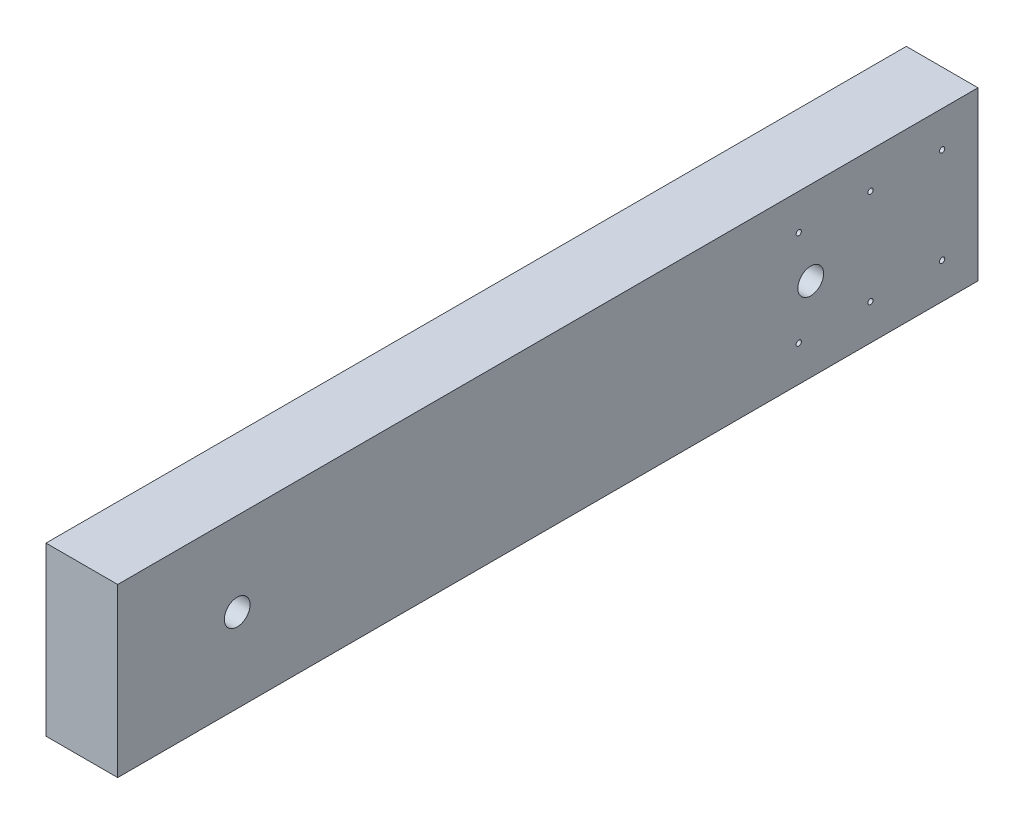
ISO-10303-21;
HEADER;
FILE_DESCRIPTION(('STEP AP214'),'2;1');
FILE_NAME('part.step','',(''),(''),'','','');
FILE_SCHEMA(('AUTOMOTIVE_DESIGN { 1 0 10303 214 1 1 1 1 }'));
ENDSEC;
DATA;
#1=APPLICATION_CONTEXT('core data for automotive mechanical design processes');
#2=APPLICATION_PROTOCOL_DEFINITION('international standard','automotive_design',2000,#1);
#3=PRODUCT_CONTEXT('',#1,'mechanical');
#4=PRODUCT('Part','Part','',(#3));
#5=PRODUCT_RELATED_PRODUCT_CATEGORY('part','',(#4));
#6=PRODUCT_DEFINITION_FORMATION('','',#4);
#7=PRODUCT_DEFINITION_CONTEXT('part definition',#1,'design');
#8=PRODUCT_DEFINITION('design','',#6,#7);
#9=PRODUCT_DEFINITION_SHAPE('','',#8);
#10=(LENGTH_UNIT() NAMED_UNIT(*) SI_UNIT(.MILLI.,.METRE.));
#11=(NAMED_UNIT(*) PLANE_ANGLE_UNIT() SI_UNIT($,.RADIAN.));
#12=(NAMED_UNIT(*) SI_UNIT($,.STERADIAN.) SOLID_ANGLE_UNIT());
#13=UNCERTAINTY_MEASURE_WITH_UNIT(LENGTH_MEASURE(1.E-05),#10,'distance_accuracy_value','');
#14=(GEOMETRIC_REPRESENTATION_CONTEXT(3) GLOBAL_UNCERTAINTY_ASSIGNED_CONTEXT((#13)) GLOBAL_UNIT_ASSIGNED_CONTEXT((#10,
#11,#12)) REPRESENTATION_CONTEXT('',''));
#15=CARTESIAN_POINT('',(0.,0.,0.));
#16=DIRECTION('',(0.,0.,1.));
#17=DIRECTION('',(1.,0.,0.));
#18=AXIS2_PLACEMENT_3D('',#15,#16,#17);
#19=CARTESIAN_POINT('',(57.277,-38.1,876.3));
#20=DIRECTION('',(1.,0.,0.));
#21=DIRECTION('',(0.,1.,0.));
#22=AXIS2_PLACEMENT_3D('',#19,#20,#21);
#23=PLANE('',#22);
#24=CARTESIAN_POINT('',(57.277,-82.55,812.8));
#25=DIRECTION('',(-1.,0.,0.));
#26=DIRECTION('',(0.,-1.,0.));
#27=AXIS2_PLACEMENT_3D('',#24,#25,#26);
#28=CIRCLE('',#27,6.84999999999997);
#29=CARTESIAN_POINT('',(57.277,-89.3999999999999,812.8));
#30=VERTEX_POINT('',#29);
#31=EDGE_CURVE('E119',#30,#30,#28,.T.);
#32=ORIENTED_EDGE('',*,*,#31,.F.);
#33=EDGE_LOOP('',(#32));
#34=FACE_BOUND('',#33,.T.);
#35=CARTESIAN_POINT('',(57.277,-82.55,508.));
#36=DIRECTION('',(1.,0.,0.));
#37=DIRECTION('',(0.,1.,0.));
#38=AXIS2_PLACEMENT_3D('',#35,#36,#37);
#39=CIRCLE('',#38,6.84999999999997);
#40=CARTESIAN_POINT('',(57.277,-75.7,508.));
#41=VERTEX_POINT('',#40);
#42=EDGE_CURVE('E112',#41,#41,#39,.F.);
#43=ORIENTED_EDGE('',*,*,#42,.F.);
#44=EDGE_LOOP('',(#43));
#45=FACE_BOUND('',#44,.T.);
#46=CARTESIAN_POINT('',(57.2770000000001,-107.95,438.15));
#47=DIRECTION('',(1.,0.,0.));
#48=DIRECTION('',(0.,1.,0.));
#49=AXIS2_PLACEMENT_3D('',#46,#47,#48);
#50=CIRCLE('',#49,1.3890625000001);
#51=CARTESIAN_POINT('',(57.2770000000001,-106.5609375,438.15));
#52=VERTEX_POINT('',#51);
#53=EDGE_CURVE('E116',#52,#52,#50,.T.);
#54=ORIENTED_EDGE('',*,*,#53,.T.);
#55=EDGE_LOOP('',(#54));
#56=FACE_BOUND('',#55,.T.);
#57=CARTESIAN_POINT('',(57.2770000000001,-107.95,476.25));
#58=DIRECTION('',(1.,0.,0.));
#59=DIRECTION('',(0.,1.,0.));
#60=AXIS2_PLACEMENT_3D('',#57,#58,#59);
#61=CIRCLE('',#60,1.3890625000001);
#62=CARTESIAN_POINT('',(57.2770000000001,-106.5609375,476.25));
#63=VERTEX_POINT('',#62);
#64=EDGE_CURVE('E132',#63,#63,#61,.T.);
#65=ORIENTED_EDGE('',*,*,#64,.T.);
#66=EDGE_LOOP('',(#65));
#67=FACE_BOUND('',#66,.T.);
#68=CARTESIAN_POINT('',(57.277,-57.15,476.25));
#69=DIRECTION('',(1.,0.,0.));
#70=DIRECTION('',(0.,1.,0.));
#71=AXIS2_PLACEMENT_3D('',#68,#69,#70);
#72=CIRCLE('',#71,1.38906250000009);
#73=CARTESIAN_POINT('',(57.277,-55.7609374999999,476.25));
#74=VERTEX_POINT('',#73);
#75=EDGE_CURVE('E138',#74,#74,#72,.T.);
#76=ORIENTED_EDGE('',*,*,#75,.T.);
#77=EDGE_LOOP('',(#76));
#78=FACE_BOUND('',#77,.T.);
#79=CARTESIAN_POINT('',(57.277,-57.15,514.35));
#80=DIRECTION('',(1.,0.,0.));
#81=DIRECTION('',(0.,1.,0.));
#82=AXIS2_PLACEMENT_3D('',#79,#80,#81);
#83=CIRCLE('',#82,1.3890625000001);
#84=CARTESIAN_POINT('',(57.277,-55.7609374999999,514.35));
#85=VERTEX_POINT('',#84);
#86=EDGE_CURVE('E144',#85,#85,#83,.T.);
#87=ORIENTED_EDGE('',*,*,#86,.T.);
#88=EDGE_LOOP('',(#87));
#89=FACE_BOUND('',#88,.T.);
#90=CARTESIAN_POINT('',(57.2770000000001,-107.95,514.35));
#91=DIRECTION('',(1.,0.,0.));
#92=DIRECTION('',(0.,1.,0.));
#93=AXIS2_PLACEMENT_3D('',#90,#91,#92);
#94=CIRCLE('',#93,1.3890625000001);
#95=CARTESIAN_POINT('',(57.2770000000001,-106.5609375,514.35));
#96=VERTEX_POINT('',#95);
#97=EDGE_CURVE('E150',#96,#96,#94,.T.);
#98=ORIENTED_EDGE('',*,*,#97,.T.);
#99=EDGE_LOOP('',(#98));
#100=FACE_BOUND('',#99,.T.);
#101=CARTESIAN_POINT('',(57.277,-57.15,438.15));
#102=DIRECTION('',(1.,0.,0.));
#103=DIRECTION('',(0.,1.,0.));
#104=AXIS2_PLACEMENT_3D('',#101,#102,#103);
#105=CIRCLE('',#104,1.38906250000009);
#106=CARTESIAN_POINT('',(57.277,-55.7609374999999,438.15));
#107=VERTEX_POINT('',#106);
#108=EDGE_CURVE('E156',#107,#107,#105,.T.);
#109=ORIENTED_EDGE('',*,*,#108,.T.);
#110=EDGE_LOOP('',(#109));
#111=FACE_BOUND('',#110,.T.);
#112=DIRECTION('',(0.,-1.,0.));
#113=VECTOR('',#112,1.);
#114=CARTESIAN_POINT('',(57.277,-38.1,419.1));
#115=LINE('',#114,#113);
#116=CARTESIAN_POINT('',(57.277,-38.1,419.1));
#117=VERTEX_POINT('',#116);
#118=CARTESIAN_POINT('',(57.277,-127.,419.1));
#119=VERTEX_POINT('',#118);
#120=EDGE_CURVE('E102',#117,#119,#115,.T.);
#121=ORIENTED_EDGE('',*,*,#120,.T.);
#122=DIRECTION('',(0.,0.,-1.));
#123=VECTOR('',#122,1.);
#124=CARTESIAN_POINT('',(57.277,-127.,876.3));
#125=LINE('',#124,#123);
#126=CARTESIAN_POINT('',(57.277,-127.,876.3));
#127=VERTEX_POINT('',#126);
#128=EDGE_CURVE('E11',#127,#119,#125,.T.);
#129=ORIENTED_EDGE('',*,*,#128,.F.);
#130=DIRECTION('',(0.,-1.,0.));
#131=VECTOR('',#130,1.);
#132=CARTESIAN_POINT('',(57.277,-38.1,876.3));
#133=LINE('',#132,#131);
#134=CARTESIAN_POINT('',(57.277,-38.1,876.3));
#135=VERTEX_POINT('',#134);
#136=EDGE_CURVE('E89',#135,#127,#133,.T.);
#137=ORIENTED_EDGE('',*,*,#136,.F.);
#138=DIRECTION('',(0.,0.,-1.));
#139=VECTOR('',#138,1.);
#140=CARTESIAN_POINT('',(57.277,-38.1,876.3));
#141=LINE('',#140,#139);
#142=EDGE_CURVE('E98',#135,#117,#141,.T.);
#143=ORIENTED_EDGE('',*,*,#142,.T.);
#144=EDGE_LOOP('',(#121,#129,#137,#143));
#145=FACE_BOUND('',#144,.T.);
#146=ADVANCED_FACE('F36',(#34,#45,#56,#67,#78,#89,#100,#111,#145),#23,.F.);
#147=CARTESIAN_POINT('',(57.277,-127.,876.3));
#148=DIRECTION('',(0.,1.,0.));
#149=DIRECTION('',(0.,0.,1.));
#150=AXIS2_PLACEMENT_3D('',#147,#148,#149);
#151=PLANE('',#150);
#152=DIRECTION('',(1.,0.,0.));
#153=VECTOR('',#152,1.);
#154=CARTESIAN_POINT('',(57.277,-127.,419.1));
#155=LINE('',#154,#153);
#156=CARTESIAN_POINT('',(95.377,-127.,419.1));
#157=VERTEX_POINT('',#156);
#158=EDGE_CURVE('E93',#119,#157,#155,.T.);
#159=ORIENTED_EDGE('',*,*,#158,.T.);
#160=DIRECTION('',(0.,0.,-1.));
#161=VECTOR('',#160,1.);
#162=CARTESIAN_POINT('',(95.377,-127.,876.3));
#163=LINE('',#162,#161);
#164=CARTESIAN_POINT('',(95.377,-127.,876.3));
#165=VERTEX_POINT('',#164);
#166=EDGE_CURVE('E45',#165,#157,#163,.T.);
#167=ORIENTED_EDGE('',*,*,#166,.F.);
#168=DIRECTION('',(1.,0.,0.));
#169=VECTOR('',#168,1.);
#170=CARTESIAN_POINT('',(57.277,-127.,876.3));
#171=LINE('',#170,#169);
#172=EDGE_CURVE('E84',#127,#165,#171,.T.);
#173=ORIENTED_EDGE('',*,*,#172,.F.);
#174=ORIENTED_EDGE('',*,*,#128,.T.);
#175=EDGE_LOOP('',(#159,#167,#173,#174));
#176=FACE_BOUND('',#175,.T.);
#177=ADVANCED_FACE('F92',(#176),#151,.F.);
#178=CARTESIAN_POINT('',(95.377,-38.1,876.3));
#179=DIRECTION('',(-1.,0.,0.));
#180=DIRECTION('',(0.,-1.,0.));
#181=AXIS2_PLACEMENT_3D('',#178,#179,#180);
#182=PLANE('',#181);
#183=CARTESIAN_POINT('',(95.377,-82.55,812.8));
#184=DIRECTION('',(-1.,0.,0.));
#185=DIRECTION('',(0.,-1.,0.));
#186=AXIS2_PLACEMENT_3D('',#183,#184,#185);
#187=CIRCLE('',#186,6.84999999999997);
#188=CARTESIAN_POINT('',(95.3770000000001,-89.3999999999999,812.8));
#189=VERTEX_POINT('',#188);
#190=EDGE_CURVE('E39',#189,#189,#187,.T.);
#191=ORIENTED_EDGE('',*,*,#190,.T.);
#192=EDGE_LOOP('',(#191));
#193=FACE_BOUND('',#192,.T.);
#194=CARTESIAN_POINT('',(95.377,-82.55,508.));
#195=DIRECTION('',(-1.,0.,0.));
#196=DIRECTION('',(0.,-1.,0.));
#197=AXIS2_PLACEMENT_3D('',#194,#195,#196);
#198=CIRCLE('',#197,6.84999999999997);
#199=CARTESIAN_POINT('',(95.377,-89.3999999999999,508.));
#200=VERTEX_POINT('',#199);
#201=EDGE_CURVE('E110',#200,#200,#198,.F.);
#202=ORIENTED_EDGE('',*,*,#201,.F.);
#203=EDGE_LOOP('',(#202));
#204=FACE_BOUND('',#203,.T.);
#205=CARTESIAN_POINT('',(95.377,-57.1499999999999,438.15));
#206=DIRECTION('',(1.,0.,0.));
#207=DIRECTION('',(0.,1.,0.));
#208=AXIS2_PLACEMENT_3D('',#205,#206,#207);
#209=CIRCLE('',#208,1.38906250000009);
#210=CARTESIAN_POINT('',(95.377,-55.7609374999999,438.15));
#211=VERTEX_POINT('',#210);
#212=EDGE_CURVE('E165',#211,#211,#209,.T.);
#213=ORIENTED_EDGE('',*,*,#212,.F.);
#214=EDGE_LOOP('',(#213));
#215=FACE_BOUND('',#214,.T.);
#216=CARTESIAN_POINT('',(95.377,-107.95,438.15));
#217=DIRECTION('',(1.,0.,0.));
#218=DIRECTION('',(0.,1.,0.));
#219=AXIS2_PLACEMENT_3D('',#216,#217,#218);
#220=CIRCLE('',#219,1.3890625000001);
#221=CARTESIAN_POINT('',(95.377,-106.5609375,438.15));
#222=VERTEX_POINT('',#221);
#223=EDGE_CURVE('E171',#222,#222,#220,.T.);
#224=ORIENTED_EDGE('',*,*,#223,.F.);
#225=EDGE_LOOP('',(#224));
#226=FACE_BOUND('',#225,.T.);
#227=CARTESIAN_POINT('',(95.377,-107.95,476.25));
#228=DIRECTION('',(1.,0.,0.));
#229=DIRECTION('',(0.,1.,0.));
#230=AXIS2_PLACEMENT_3D('',#227,#228,#229);
#231=CIRCLE('',#230,1.3890625000001);
#232=CARTESIAN_POINT('',(95.377,-106.5609375,476.25));
#233=VERTEX_POINT('',#232);
#234=EDGE_CURVE('E177',#233,#233,#231,.T.);
#235=ORIENTED_EDGE('',*,*,#234,.F.);
#236=EDGE_LOOP('',(#235));
#237=FACE_BOUND('',#236,.T.);
#238=CARTESIAN_POINT('',(95.377,-57.1499999999999,476.25));
#239=DIRECTION('',(1.,0.,0.));
#240=DIRECTION('',(0.,1.,0.));
#241=AXIS2_PLACEMENT_3D('',#238,#239,#240);
#242=CIRCLE('',#241,1.38906250000009);
#243=CARTESIAN_POINT('',(95.377,-55.7609374999999,476.25));
#244=VERTEX_POINT('',#243);
#245=EDGE_CURVE('E183',#244,#244,#242,.T.);
#246=ORIENTED_EDGE('',*,*,#245,.F.);
#247=EDGE_LOOP('',(#246));
#248=FACE_BOUND('',#247,.T.);
#249=CARTESIAN_POINT('',(95.377,-57.1499999999999,514.35));
#250=DIRECTION('',(1.,0.,0.));
#251=DIRECTION('',(0.,1.,0.));
#252=AXIS2_PLACEMENT_3D('',#249,#250,#251);
#253=CIRCLE('',#252,1.3890625000001);
#254=CARTESIAN_POINT('',(95.377,-55.7609374999998,514.35));
#255=VERTEX_POINT('',#254);
#256=EDGE_CURVE('E189',#255,#255,#253,.T.);
#257=ORIENTED_EDGE('',*,*,#256,.F.);
#258=EDGE_LOOP('',(#257));
#259=FACE_BOUND('',#258,.T.);
#260=CARTESIAN_POINT('',(95.377,-107.95,514.35));
#261=DIRECTION('',(1.,0.,0.));
#262=DIRECTION('',(0.,1.,0.));
#263=AXIS2_PLACEMENT_3D('',#260,#261,#262);
#264=CIRCLE('',#263,1.3890625000001);
#265=CARTESIAN_POINT('',(95.377,-106.5609375,514.35));
#266=VERTEX_POINT('',#265);
#267=EDGE_CURVE('E162',#266,#266,#264,.T.);
#268=ORIENTED_EDGE('',*,*,#267,.F.);
#269=EDGE_LOOP('',(#268));
#270=FACE_BOUND('',#269,.T.);
#271=DIRECTION('',(0.,1.,0.));
#272=VECTOR('',#271,1.);
#273=CARTESIAN_POINT('',(95.377,-38.1,419.1));
#274=LINE('',#273,#272);
#275=CARTESIAN_POINT('',(95.377,-38.1,419.1));
#276=VERTEX_POINT('',#275);
#277=EDGE_CURVE('E71',#157,#276,#274,.T.);
#278=ORIENTED_EDGE('',*,*,#277,.T.);
#279=DIRECTION('',(0.,0.,-1.));
#280=VECTOR('',#279,1.);
#281=CARTESIAN_POINT('',(95.377,-38.1,876.3));
#282=LINE('',#281,#280);
#283=CARTESIAN_POINT('',(95.377,-38.1,876.3));
#284=VERTEX_POINT('',#283);
#285=EDGE_CURVE('E94',#284,#276,#282,.T.);
#286=ORIENTED_EDGE('',*,*,#285,.F.);
#287=DIRECTION('',(0.,1.,0.));
#288=VECTOR('',#287,1.);
#289=CARTESIAN_POINT('',(95.377,-38.1,876.3));
#290=LINE('',#289,#288);
#291=EDGE_CURVE('E87',#165,#284,#290,.T.);
#292=ORIENTED_EDGE('',*,*,#291,.F.);
#293=ORIENTED_EDGE('',*,*,#166,.T.);
#294=EDGE_LOOP('',(#278,#286,#292,#293));
#295=FACE_BOUND('',#294,.T.);
#296=ADVANCED_FACE('F96',(#193,#204,#215,#226,#237,#248,#259,#270,#295),#182,.F.);
#297=CARTESIAN_POINT('',(57.277,-38.1,876.3));
#298=DIRECTION('',(0.,-1.,0.));
#299=DIRECTION('',(0.,0.,-1.));
#300=AXIS2_PLACEMENT_3D('',#297,#298,#299);
#301=PLANE('',#300);
#302=DIRECTION('',(-1.,0.,0.));
#303=VECTOR('',#302,1.);
#304=CARTESIAN_POINT('',(57.277,-38.1,419.1));
#305=LINE('',#304,#303);
#306=EDGE_CURVE('E77',#276,#117,#305,.T.);
#307=ORIENTED_EDGE('',*,*,#306,.T.);
#308=ORIENTED_EDGE('',*,*,#142,.F.);
#309=DIRECTION('',(-1.,0.,0.));
#310=VECTOR('',#309,1.);
#311=CARTESIAN_POINT('',(57.277,-38.1,876.3));
#312=LINE('',#311,#310);
#313=EDGE_CURVE('E54',#284,#135,#312,.T.);
#314=ORIENTED_EDGE('',*,*,#313,.F.);
#315=ORIENTED_EDGE('',*,*,#285,.T.);
#316=EDGE_LOOP('',(#307,#308,#314,#315));
#317=FACE_BOUND('',#316,.T.);
#318=ADVANCED_FACE('F201',(#317),#301,.F.);
#319=CARTESIAN_POINT('',(0.,0.,876.3));
#320=DIRECTION('',(0.,0.,1.));
#321=DIRECTION('',(1.,0.,0.));
#322=AXIS2_PLACEMENT_3D('',#319,#320,#321);
#323=PLANE('',#322);
#324=ORIENTED_EDGE('',*,*,#136,.T.);
#325=ORIENTED_EDGE('',*,*,#172,.T.);
#326=ORIENTED_EDGE('',*,*,#291,.T.);
#327=ORIENTED_EDGE('',*,*,#313,.T.);
#328=EDGE_LOOP('',(#324,#325,#326,#327));
#329=FACE_BOUND('',#328,.T.);
#330=ADVANCED_FACE('F85',(#329),#323,.T.);
#331=CARTESIAN_POINT('',(0.,0.,419.1));
#332=DIRECTION('',(0.,0.,1.));
#333=DIRECTION('',(1.,0.,0.));
#334=AXIS2_PLACEMENT_3D('',#331,#332,#333);
#335=PLANE('',#334);
#336=ORIENTED_EDGE('',*,*,#120,.F.);
#337=ORIENTED_EDGE('',*,*,#306,.F.);
#338=ORIENTED_EDGE('',*,*,#277,.F.);
#339=ORIENTED_EDGE('',*,*,#158,.F.);
#340=EDGE_LOOP('',(#336,#337,#338,#339));
#341=FACE_BOUND('',#340,.T.);
#342=ADVANCED_FACE('F230',(#341),#335,.F.);
#343=CARTESIAN_POINT('',(82.677,-107.95,514.35));
#344=DIRECTION('',(1.,0.,0.));
#345=DIRECTION('',(0.,1.,0.));
#346=AXIS2_PLACEMENT_3D('',#343,#344,#345);
#347=CYLINDRICAL_SURFACE('',#346,1.3890625000001);
#348=CARTESIAN_POINT('',(82.677,-107.95,514.35));
#349=DIRECTION('',(1.,0.,0.));
#350=DIRECTION('',(0.,1.,0.));
#351=AXIS2_PLACEMENT_3D('',#348,#349,#350);
#352=CIRCLE('',#351,1.3890625000001);
#353=CARTESIAN_POINT('',(82.677,-106.5609375,514.35));
#354=VERTEX_POINT('',#353);
#355=EDGE_CURVE('E192',#354,#354,#352,.T.);
#356=ORIENTED_EDGE('',*,*,#355,.F.);
#357=EDGE_LOOP('',(#356));
#358=FACE_BOUND('',#357,.T.);
#359=ORIENTED_EDGE('',*,*,#267,.T.);
#360=EDGE_LOOP('',(#359));
#361=FACE_BOUND('',#360,.T.);
#362=ADVANCED_FACE('F198',(#358,#361),#347,.F.);
#363=CARTESIAN_POINT('',(82.677,-107.95,514.35));
#364=DIRECTION('',(1.,0.,0.));
#365=DIRECTION('',(0.,1.,0.));
#366=AXIS2_PLACEMENT_3D('',#363,#364,#365);
#367=PLANE('',#366);
#368=ORIENTED_EDGE('',*,*,#355,.T.);
#369=EDGE_LOOP('',(#368));
#370=FACE_BOUND('',#369,.T.);
#371=ADVANCED_FACE('F237',(#370),#367,.T.);
#372=CARTESIAN_POINT('',(82.677,-57.1499999999999,514.35));
#373=DIRECTION('',(1.,0.,0.));
#374=DIRECTION('',(0.,1.,0.));
#375=AXIS2_PLACEMENT_3D('',#372,#373,#374);
#376=CYLINDRICAL_SURFACE('',#375,1.3890625000001);
#377=CARTESIAN_POINT('',(82.677,-57.1499999999999,514.35));
#378=DIRECTION('',(1.,0.,0.));
#379=DIRECTION('',(0.,1.,0.));
#380=AXIS2_PLACEMENT_3D('',#377,#378,#379);
#381=CIRCLE('',#380,1.3890625000001);
#382=CARTESIAN_POINT('',(82.677,-55.7609374999998,514.35));
#383=VERTEX_POINT('',#382);
#384=EDGE_CURVE('E186',#383,#383,#381,.T.);
#385=ORIENTED_EDGE('',*,*,#384,.F.);
#386=EDGE_LOOP('',(#385));
#387=FACE_BOUND('',#386,.T.);
#388=ORIENTED_EDGE('',*,*,#256,.T.);
#389=EDGE_LOOP('',(#388));
#390=FACE_BOUND('',#389,.T.);
#391=ADVANCED_FACE('F244',(#387,#390),#376,.F.);
#392=CARTESIAN_POINT('',(82.677,-57.1499999999999,514.35));
#393=DIRECTION('',(1.,0.,0.));
#394=DIRECTION('',(0.,1.,0.));
#395=AXIS2_PLACEMENT_3D('',#392,#393,#394);
#396=PLANE('',#395);
#397=ORIENTED_EDGE('',*,*,#384,.T.);
#398=EDGE_LOOP('',(#397));
#399=FACE_BOUND('',#398,.T.);
#400=ADVANCED_FACE('F248',(#399),#396,.T.);
#401=CARTESIAN_POINT('',(82.677,-57.1499999999999,476.25));
#402=DIRECTION('',(1.,0.,0.));
#403=DIRECTION('',(0.,1.,0.));
#404=AXIS2_PLACEMENT_3D('',#401,#402,#403);
#405=CYLINDRICAL_SURFACE('',#404,1.38906250000009);
#406=CARTESIAN_POINT('',(82.677,-57.1499999999999,476.25));
#407=DIRECTION('',(1.,0.,0.));
#408=DIRECTION('',(0.,1.,0.));
#409=AXIS2_PLACEMENT_3D('',#406,#407,#408);
#410=CIRCLE('',#409,1.38906250000009);
#411=CARTESIAN_POINT('',(82.677,-55.7609374999999,476.25));
#412=VERTEX_POINT('',#411);
#413=EDGE_CURVE('E180',#412,#412,#410,.T.);
#414=ORIENTED_EDGE('',*,*,#413,.F.);
#415=EDGE_LOOP('',(#414));
#416=FACE_BOUND('',#415,.T.);
#417=ORIENTED_EDGE('',*,*,#245,.T.);
#418=EDGE_LOOP('',(#417));
#419=FACE_BOUND('',#418,.T.);
#420=ADVANCED_FACE('F252',(#416,#419),#405,.F.);
#421=CARTESIAN_POINT('',(82.677,-57.1499999999999,476.25));
#422=DIRECTION('',(1.,0.,0.));
#423=DIRECTION('',(0.,1.,0.));
#424=AXIS2_PLACEMENT_3D('',#421,#422,#423);
#425=PLANE('',#424);
#426=ORIENTED_EDGE('',*,*,#413,.T.);
#427=EDGE_LOOP('',(#426));
#428=FACE_BOUND('',#427,.T.);
#429=ADVANCED_FACE('F256',(#428),#425,.T.);
#430=CARTESIAN_POINT('',(82.677,-107.95,476.25));
#431=DIRECTION('',(1.,0.,0.));
#432=DIRECTION('',(0.,1.,0.));
#433=AXIS2_PLACEMENT_3D('',#430,#431,#432);
#434=CYLINDRICAL_SURFACE('',#433,1.3890625000001);
#435=CARTESIAN_POINT('',(82.677,-107.95,476.25));
#436=DIRECTION('',(1.,0.,0.));
#437=DIRECTION('',(0.,1.,0.));
#438=AXIS2_PLACEMENT_3D('',#435,#436,#437);
#439=CIRCLE('',#438,1.3890625000001);
#440=CARTESIAN_POINT('',(82.677,-106.5609375,476.25));
#441=VERTEX_POINT('',#440);
#442=EDGE_CURVE('E174',#441,#441,#439,.T.);
#443=ORIENTED_EDGE('',*,*,#442,.F.);
#444=EDGE_LOOP('',(#443));
#445=FACE_BOUND('',#444,.T.);
#446=ORIENTED_EDGE('',*,*,#234,.T.);
#447=EDGE_LOOP('',(#446));
#448=FACE_BOUND('',#447,.T.);
#449=ADVANCED_FACE('F260',(#445,#448),#434,.F.);
#450=CARTESIAN_POINT('',(82.677,-107.95,476.25));
#451=DIRECTION('',(1.,0.,0.));
#452=DIRECTION('',(0.,1.,0.));
#453=AXIS2_PLACEMENT_3D('',#450,#451,#452);
#454=PLANE('',#453);
#455=ORIENTED_EDGE('',*,*,#442,.T.);
#456=EDGE_LOOP('',(#455));
#457=FACE_BOUND('',#456,.T.);
#458=ADVANCED_FACE('F264',(#457),#454,.T.);
#459=CARTESIAN_POINT('',(82.677,-107.95,438.15));
#460=DIRECTION('',(1.,0.,0.));
#461=DIRECTION('',(0.,1.,0.));
#462=AXIS2_PLACEMENT_3D('',#459,#460,#461);
#463=CYLINDRICAL_SURFACE('',#462,1.3890625000001);
#464=CARTESIAN_POINT('',(82.677,-107.95,438.15));
#465=DIRECTION('',(1.,0.,0.));
#466=DIRECTION('',(0.,1.,0.));
#467=AXIS2_PLACEMENT_3D('',#464,#465,#466);
#468=CIRCLE('',#467,1.3890625000001);
#469=CARTESIAN_POINT('',(82.677,-106.5609375,438.15));
#470=VERTEX_POINT('',#469);
#471=EDGE_CURVE('E168',#470,#470,#468,.T.);
#472=ORIENTED_EDGE('',*,*,#471,.F.);
#473=EDGE_LOOP('',(#472));
#474=FACE_BOUND('',#473,.T.);
#475=ORIENTED_EDGE('',*,*,#223,.T.);
#476=EDGE_LOOP('',(#475));
#477=FACE_BOUND('',#476,.T.);
#478=ADVANCED_FACE('F268',(#474,#477),#463,.F.);
#479=CARTESIAN_POINT('',(82.677,-107.95,438.15));
#480=DIRECTION('',(1.,0.,0.));
#481=DIRECTION('',(0.,1.,0.));
#482=AXIS2_PLACEMENT_3D('',#479,#480,#481);
#483=PLANE('',#482);
#484=ORIENTED_EDGE('',*,*,#471,.T.);
#485=EDGE_LOOP('',(#484));
#486=FACE_BOUND('',#485,.T.);
#487=ADVANCED_FACE('F272',(#486),#483,.T.);
#488=CARTESIAN_POINT('',(82.677,-57.1499999999999,438.15));
#489=DIRECTION('',(1.,0.,0.));
#490=DIRECTION('',(0.,1.,0.));
#491=AXIS2_PLACEMENT_3D('',#488,#489,#490);
#492=CYLINDRICAL_SURFACE('',#491,1.38906250000009);
#493=CARTESIAN_POINT('',(82.677,-57.1499999999999,438.15));
#494=DIRECTION('',(1.,0.,0.));
#495=DIRECTION('',(0.,1.,0.));
#496=AXIS2_PLACEMENT_3D('',#493,#494,#495);
#497=CIRCLE('',#496,1.38906250000009);
#498=CARTESIAN_POINT('',(82.677,-55.7609374999999,438.15));
#499=VERTEX_POINT('',#498);
#500=EDGE_CURVE('E105',#499,#499,#497,.T.);
#501=ORIENTED_EDGE('',*,*,#500,.F.);
#502=EDGE_LOOP('',(#501));
#503=FACE_BOUND('',#502,.T.);
#504=ORIENTED_EDGE('',*,*,#212,.T.);
#505=EDGE_LOOP('',(#504));
#506=FACE_BOUND('',#505,.T.);
#507=ADVANCED_FACE('F276',(#503,#506),#492,.F.);
#508=CARTESIAN_POINT('',(82.677,-57.1499999999999,438.15));
#509=DIRECTION('',(1.,0.,0.));
#510=DIRECTION('',(0.,1.,0.));
#511=AXIS2_PLACEMENT_3D('',#508,#509,#510);
#512=PLANE('',#511);
#513=ORIENTED_EDGE('',*,*,#500,.T.);
#514=EDGE_LOOP('',(#513));
#515=FACE_BOUND('',#514,.T.);
#516=ADVANCED_FACE('F280',(#515),#512,.T.);
#517=CARTESIAN_POINT('',(69.977,-57.15,438.15));
#518=DIRECTION('',(-1.,0.,0.));
#519=DIRECTION('',(0.,1.,0.));
#520=AXIS2_PLACEMENT_3D('',#517,#518,#519);
#521=CYLINDRICAL_SURFACE('',#520,1.38906250000009);
#522=CARTESIAN_POINT('',(69.977,-57.15,438.15));
#523=DIRECTION('',(1.,0.,0.));
#524=DIRECTION('',(0.,1.,0.));
#525=AXIS2_PLACEMENT_3D('',#522,#523,#524);
#526=CIRCLE('',#525,1.38906250000009);
#527=CARTESIAN_POINT('',(69.977,-55.7609374999999,438.15));
#528=VERTEX_POINT('',#527);
#529=EDGE_CURVE('E159',#528,#528,#526,.T.);
#530=ORIENTED_EDGE('',*,*,#529,.T.);
#531=EDGE_LOOP('',(#530));
#532=FACE_BOUND('',#531,.T.);
#533=ORIENTED_EDGE('',*,*,#108,.F.);
#534=EDGE_LOOP('',(#533));
#535=FACE_BOUND('',#534,.T.);
#536=ADVANCED_FACE('F284',(#532,#535),#521,.F.);
#537=CARTESIAN_POINT('',(69.977,-57.15,438.15));
#538=DIRECTION('',(-1.,0.,0.));
#539=DIRECTION('',(0.,1.,0.));
#540=AXIS2_PLACEMENT_3D('',#537,#538,#539);
#541=PLANE('',#540);
#542=ORIENTED_EDGE('',*,*,#529,.F.);
#543=EDGE_LOOP('',(#542));
#544=FACE_BOUND('',#543,.T.);
#545=ADVANCED_FACE('F288',(#544),#541,.T.);
#546=CARTESIAN_POINT('',(69.977,-107.95,514.35));
#547=DIRECTION('',(-1.,0.,0.));
#548=DIRECTION('',(0.,1.,0.));
#549=AXIS2_PLACEMENT_3D('',#546,#547,#548);
#550=CYLINDRICAL_SURFACE('',#549,1.3890625000001);
#551=CARTESIAN_POINT('',(69.977,-107.95,514.35));
#552=DIRECTION('',(1.,0.,0.));
#553=DIRECTION('',(0.,1.,0.));
#554=AXIS2_PLACEMENT_3D('',#551,#552,#553);
#555=CIRCLE('',#554,1.3890625000001);
#556=CARTESIAN_POINT('',(69.977,-106.5609375,514.35));
#557=VERTEX_POINT('',#556);
#558=EDGE_CURVE('E153',#557,#557,#555,.T.);
#559=ORIENTED_EDGE('',*,*,#558,.T.);
#560=EDGE_LOOP('',(#559));
#561=FACE_BOUND('',#560,.T.);
#562=ORIENTED_EDGE('',*,*,#97,.F.);
#563=EDGE_LOOP('',(#562));
#564=FACE_BOUND('',#563,.T.);
#565=ADVANCED_FACE('F292',(#561,#564),#550,.F.);
#566=CARTESIAN_POINT('',(69.977,-107.95,514.35));
#567=DIRECTION('',(-1.,0.,0.));
#568=DIRECTION('',(0.,1.,0.));
#569=AXIS2_PLACEMENT_3D('',#566,#567,#568);
#570=PLANE('',#569);
#571=ORIENTED_EDGE('',*,*,#558,.F.);
#572=EDGE_LOOP('',(#571));
#573=FACE_BOUND('',#572,.T.);
#574=ADVANCED_FACE('F296',(#573),#570,.T.);
#575=CARTESIAN_POINT('',(69.977,-57.15,514.35));
#576=DIRECTION('',(-1.,0.,0.));
#577=DIRECTION('',(0.,1.,0.));
#578=AXIS2_PLACEMENT_3D('',#575,#576,#577);
#579=CYLINDRICAL_SURFACE('',#578,1.3890625000001);
#580=CARTESIAN_POINT('',(69.977,-57.15,514.35));
#581=DIRECTION('',(1.,0.,0.));
#582=DIRECTION('',(0.,1.,0.));
#583=AXIS2_PLACEMENT_3D('',#580,#581,#582);
#584=CIRCLE('',#583,1.3890625000001);
#585=CARTESIAN_POINT('',(69.977,-55.7609374999999,514.35));
#586=VERTEX_POINT('',#585);
#587=EDGE_CURVE('E147',#586,#586,#584,.T.);
#588=ORIENTED_EDGE('',*,*,#587,.T.);
#589=EDGE_LOOP('',(#588));
#590=FACE_BOUND('',#589,.T.);
#591=ORIENTED_EDGE('',*,*,#86,.F.);
#592=EDGE_LOOP('',(#591));
#593=FACE_BOUND('',#592,.T.);
#594=ADVANCED_FACE('F300',(#590,#593),#579,.F.);
#595=CARTESIAN_POINT('',(69.977,-57.15,514.35));
#596=DIRECTION('',(-1.,0.,0.));
#597=DIRECTION('',(0.,1.,0.));
#598=AXIS2_PLACEMENT_3D('',#595,#596,#597);
#599=PLANE('',#598);
#600=ORIENTED_EDGE('',*,*,#587,.F.);
#601=EDGE_LOOP('',(#600));
#602=FACE_BOUND('',#601,.T.);
#603=ADVANCED_FACE('F304',(#602),#599,.T.);
#604=CARTESIAN_POINT('',(69.977,-57.15,476.25));
#605=DIRECTION('',(-1.,0.,0.));
#606=DIRECTION('',(0.,1.,0.));
#607=AXIS2_PLACEMENT_3D('',#604,#605,#606);
#608=CYLINDRICAL_SURFACE('',#607,1.38906250000009);
#609=CARTESIAN_POINT('',(69.977,-57.15,476.25));
#610=DIRECTION('',(1.,0.,0.));
#611=DIRECTION('',(0.,1.,0.));
#612=AXIS2_PLACEMENT_3D('',#609,#610,#611);
#613=CIRCLE('',#612,1.38906250000009);
#614=CARTESIAN_POINT('',(69.977,-55.7609374999999,476.25));
#615=VERTEX_POINT('',#614);
#616=EDGE_CURVE('E141',#615,#615,#613,.T.);
#617=ORIENTED_EDGE('',*,*,#616,.T.);
#618=EDGE_LOOP('',(#617));
#619=FACE_BOUND('',#618,.T.);
#620=ORIENTED_EDGE('',*,*,#75,.F.);
#621=EDGE_LOOP('',(#620));
#622=FACE_BOUND('',#621,.T.);
#623=ADVANCED_FACE('F308',(#619,#622),#608,.F.);
#624=CARTESIAN_POINT('',(69.977,-57.15,476.25));
#625=DIRECTION('',(-1.,0.,0.));
#626=DIRECTION('',(0.,1.,0.));
#627=AXIS2_PLACEMENT_3D('',#624,#625,#626);
#628=PLANE('',#627);
#629=ORIENTED_EDGE('',*,*,#616,.F.);
#630=EDGE_LOOP('',(#629));
#631=FACE_BOUND('',#630,.T.);
#632=ADVANCED_FACE('F312',(#631),#628,.T.);
#633=CARTESIAN_POINT('',(69.977,-107.95,476.25));
#634=DIRECTION('',(-1.,0.,0.));
#635=DIRECTION('',(0.,1.,0.));
#636=AXIS2_PLACEMENT_3D('',#633,#634,#635);
#637=CYLINDRICAL_SURFACE('',#636,1.3890625000001);
#638=CARTESIAN_POINT('',(69.977,-107.95,476.25));
#639=DIRECTION('',(1.,0.,0.));
#640=DIRECTION('',(0.,1.,0.));
#641=AXIS2_PLACEMENT_3D('',#638,#639,#640);
#642=CIRCLE('',#641,1.3890625000001);
#643=CARTESIAN_POINT('',(69.977,-106.5609375,476.25));
#644=VERTEX_POINT('',#643);
#645=EDGE_CURVE('E135',#644,#644,#642,.T.);
#646=ORIENTED_EDGE('',*,*,#645,.T.);
#647=EDGE_LOOP('',(#646));
#648=FACE_BOUND('',#647,.T.);
#649=ORIENTED_EDGE('',*,*,#64,.F.);
#650=EDGE_LOOP('',(#649));
#651=FACE_BOUND('',#650,.T.);
#652=ADVANCED_FACE('F316',(#648,#651),#637,.F.);
#653=CARTESIAN_POINT('',(69.977,-107.95,476.25));
#654=DIRECTION('',(-1.,0.,0.));
#655=DIRECTION('',(0.,1.,0.));
#656=AXIS2_PLACEMENT_3D('',#653,#654,#655);
#657=PLANE('',#656);
#658=ORIENTED_EDGE('',*,*,#645,.F.);
#659=EDGE_LOOP('',(#658));
#660=FACE_BOUND('',#659,.T.);
#661=ADVANCED_FACE('F320',(#660),#657,.T.);
#662=CARTESIAN_POINT('',(69.977,-107.95,438.15));
#663=DIRECTION('',(-1.,0.,0.));
#664=DIRECTION('',(0.,1.,0.));
#665=AXIS2_PLACEMENT_3D('',#662,#663,#664);
#666=CYLINDRICAL_SURFACE('',#665,1.3890625000001);
#667=CARTESIAN_POINT('',(69.977,-107.95,438.15));
#668=DIRECTION('',(1.,0.,0.));
#669=DIRECTION('',(0.,1.,0.));
#670=AXIS2_PLACEMENT_3D('',#667,#668,#669);
#671=CIRCLE('',#670,1.3890625000001);
#672=CARTESIAN_POINT('',(69.977,-106.5609375,438.15));
#673=VERTEX_POINT('',#672);
#674=EDGE_CURVE('E129',#673,#673,#671,.T.);
#675=ORIENTED_EDGE('',*,*,#674,.T.);
#676=EDGE_LOOP('',(#675));
#677=FACE_BOUND('',#676,.T.);
#678=ORIENTED_EDGE('',*,*,#53,.F.);
#679=EDGE_LOOP('',(#678));
#680=FACE_BOUND('',#679,.T.);
#681=ADVANCED_FACE('F324',(#677,#680),#666,.F.);
#682=CARTESIAN_POINT('',(69.977,-107.95,438.15));
#683=DIRECTION('',(-1.,0.,0.));
#684=DIRECTION('',(0.,1.,0.));
#685=AXIS2_PLACEMENT_3D('',#682,#683,#684);
#686=PLANE('',#685);
#687=ORIENTED_EDGE('',*,*,#674,.F.);
#688=EDGE_LOOP('',(#687));
#689=FACE_BOUND('',#688,.T.);
#690=ADVANCED_FACE('F328',(#689),#686,.T.);
#691=CARTESIAN_POINT('',(101.727,-82.55,508.));
#692=DIRECTION('',(-1.,0.,0.));
#693=DIRECTION('',(0.,0.,1.));
#694=AXIS2_PLACEMENT_3D('',#691,#692,#693);
#695=CYLINDRICAL_SURFACE('',#694,6.84999999999997);
#696=ORIENTED_EDGE('',*,*,#201,.T.);
#697=EDGE_LOOP('',(#696));
#698=FACE_BOUND('',#697,.T.);
#699=ORIENTED_EDGE('',*,*,#42,.T.);
#700=EDGE_LOOP('',(#699));
#701=FACE_BOUND('',#700,.T.);
#702=ADVANCED_FACE('F332',(#698,#701),#695,.F.);
#703=CARTESIAN_POINT('',(101.727,-82.55,812.8));
#704=DIRECTION('',(-1.,0.,0.));
#705=DIRECTION('',(0.,-1.,0.));
#706=AXIS2_PLACEMENT_3D('',#703,#704,#705);
#707=CYLINDRICAL_SURFACE('',#706,6.84999999999997);
#708=CARTESIAN_POINT('',(57.277,-89.3999999999999,812.8));
#709=CARTESIAN_POINT('',(57.673875,-89.3999999999999,812.8));
#710=CARTESIAN_POINT('',(58.07075,-89.3999999999999,812.8));
#711=CARTESIAN_POINT('',(58.8645,-89.3999999999999,812.8));
#712=CARTESIAN_POINT('',(59.261375,-89.3999999999999,812.8));
#713=CARTESIAN_POINT('',(60.055125,-89.3999999999999,812.8));
#714=CARTESIAN_POINT('',(60.452,-89.3999999999999,812.8));
#715=CARTESIAN_POINT('',(61.24575,-89.3999999999999,812.8));
#716=CARTESIAN_POINT('',(61.642625,-89.3999999999999,812.8));
#717=CARTESIAN_POINT('',(62.436375,-89.3999999999999,812.8));
#718=CARTESIAN_POINT('',(62.83325,-89.3999999999999,812.8));
#719=CARTESIAN_POINT('',(63.627,-89.3999999999999,812.8));
#720=CARTESIAN_POINT('',(64.023875,-89.3999999999999,812.8));
#721=CARTESIAN_POINT('',(64.817625,-89.3999999999999,812.8));
#722=CARTESIAN_POINT('',(65.2145,-89.3999999999999,812.8));
#723=CARTESIAN_POINT('',(66.00825,-89.3999999999999,812.8));
#724=CARTESIAN_POINT('',(66.405125,-89.3999999999999,812.8));
#725=CARTESIAN_POINT('',(67.198875,-89.3999999999999,812.8));
#726=CARTESIAN_POINT('',(67.59575,-89.3999999999999,812.8));
#727=CARTESIAN_POINT('',(68.3895,-89.3999999999999,812.8));
#728=CARTESIAN_POINT('',(68.786375,-89.3999999999999,812.8));
#729=CARTESIAN_POINT('',(69.580125,-89.3999999999999,812.8));
#730=CARTESIAN_POINT('',(69.977,-89.3999999999999,812.8));
#731=CARTESIAN_POINT('',(70.77075,-89.3999999999999,812.8));
#732=CARTESIAN_POINT('',(71.167625,-89.3999999999999,812.8));
#733=CARTESIAN_POINT('',(71.961375,-89.3999999999999,812.8));
#734=CARTESIAN_POINT('',(72.35825,-89.3999999999999,812.8));
#735=CARTESIAN_POINT('',(73.152,-89.3999999999999,812.8));
#736=CARTESIAN_POINT('',(73.548875,-89.3999999999999,812.8));
#737=CARTESIAN_POINT('',(74.342625,-89.3999999999999,812.8));
#738=CARTESIAN_POINT('',(74.7395,-89.3999999999999,812.8));
#739=CARTESIAN_POINT('',(75.53325,-89.3999999999999,812.8));
#740=CARTESIAN_POINT('',(75.930125,-89.3999999999999,812.8));
#741=CARTESIAN_POINT('',(76.723875,-89.3999999999999,812.8));
#742=CARTESIAN_POINT('',(77.12075,-89.3999999999999,812.8));
#743=CARTESIAN_POINT('',(77.9145,-89.3999999999999,812.8));
#744=CARTESIAN_POINT('',(78.311375,-89.3999999999999,812.8));
#745=CARTESIAN_POINT('',(79.105125,-89.3999999999999,812.8));
#746=CARTESIAN_POINT('',(79.502,-89.3999999999999,812.8));
#747=CARTESIAN_POINT('',(80.29575,-89.3999999999999,812.8));
#748=CARTESIAN_POINT('',(80.692625,-89.3999999999999,812.8));
#749=CARTESIAN_POINT('',(81.486375,-89.3999999999999,812.8));
#750=CARTESIAN_POINT('',(81.88325,-89.3999999999999,812.8));
#751=CARTESIAN_POINT('',(82.677,-89.3999999999999,812.8));
#752=CARTESIAN_POINT('',(83.073875,-89.3999999999999,812.8));
#753=CARTESIAN_POINT('',(83.867625,-89.3999999999999,812.8));
#754=CARTESIAN_POINT('',(84.2645,-89.3999999999999,812.8));
#755=CARTESIAN_POINT('',(85.05825,-89.3999999999999,812.8));
#756=CARTESIAN_POINT('',(85.4551250000001,-89.3999999999999,812.8));
#757=CARTESIAN_POINT('',(86.2488750000001,-89.3999999999999,812.8));
#758=CARTESIAN_POINT('',(86.64575,-89.3999999999999,812.8));
#759=CARTESIAN_POINT('',(87.4395000000001,-89.3999999999999,812.8));
#760=CARTESIAN_POINT('',(87.836375,-89.3999999999999,812.8));
#761=CARTESIAN_POINT('',(88.6301250000001,-89.3999999999999,812.8));
#762=CARTESIAN_POINT('',(89.027,-89.3999999999999,812.8));
#763=CARTESIAN_POINT('',(89.8207500000001,-89.3999999999999,812.8));
#764=CARTESIAN_POINT('',(90.2176250000001,-89.3999999999999,812.8));
#765=CARTESIAN_POINT('',(91.0113750000001,-89.3999999999999,812.8));
#766=CARTESIAN_POINT('',(91.4082500000001,-89.3999999999999,812.8));
#767=CARTESIAN_POINT('',(92.2020000000001,-89.3999999999999,812.8));
#768=CARTESIAN_POINT('',(92.598875,-89.3999999999999,812.8));
#769=CARTESIAN_POINT('',(93.3926250000001,-89.3999999999999,812.8));
#770=CARTESIAN_POINT('',(93.7895,-89.3999999999999,812.8));
#771=CARTESIAN_POINT('',(94.5832500000001,-89.3999999999999,812.8));
#772=CARTESIAN_POINT('',(94.9801250000001,-89.3999999999999,812.8));
#773=CARTESIAN_POINT('',(95.3770000000001,-89.3999999999999,812.8));
#774=B_SPLINE_CURVE_WITH_KNOTS('',3,(#708,#709,#710,#711,#712,#713,#714,#715,#716,#717,#718,
#719,#720,#721,#722,#723,#724,#725,#726,#727,#728,#729,#730,#731,#732,#733,#734,#735,#736,#737,
#738,#739,#740,#741,#742,#743,#744,#745,#746,#747,#748,#749,#750,#751,#752,#753,#754,#755,#756,
#757,#758,#759,#760,#761,#762,#763,#764,#765,#766,#767,#768,#769,#770,#771,#772,#773),
.UNSPECIFIED.,.F.,.F.,(4,2,2,2,2,2,2,2,2,2,2,2,2,2,2,2,2,2,2,2,2,2,2,2,2,2,2,2,2,2,2,2,4),(0.,
1.190625,2.38125,3.571875,4.7625,5.953125,7.14375,8.334375,9.525,10.715625,11.90625,13.096875,
14.2875,15.478125,16.66875,17.859375,19.05,20.240625,21.43125,22.621875,23.8125,25.003125,
26.19375,27.384375,28.575,29.765625,30.95625,32.146875,33.3375,34.528125,35.71875,36.909375,
38.1),.UNSPECIFIED.);
#775=EDGE_CURVE('BSEAM336',#30,#189,#774,.T.);
#776=ORIENTED_EDGE('',*,*,#31,.T.);
#777=ORIENTED_EDGE('',*,*,#190,.F.);
#778=ORIENTED_EDGE('',*,*,#775,.T.);
#779=ORIENTED_EDGE('',*,*,#775,.F.);
#780=EDGE_LOOP('',(#776,#778,#777,#779));
#781=FACE_BOUND('',#780,.T.);
#782=ADVANCED_FACE('F336',(#781),#707,.F.);
#783=CLOSED_SHELL('',(#146,#177,#296,#318,#330,#342,#362,#371,#391,#400,#420,#429,#449,#458,
#478,#487,#507,#516,#536,#545,#565,#574,#594,#603,#623,#632,#652,#661,#681,#690,#702,#782));
#784=MANIFOLD_SOLID_BREP('B2',#783);
#785=ADVANCED_BREP_SHAPE_REPRESENTATION('',(#18,#784),#14);
#786=SHAPE_DEFINITION_REPRESENTATION(#9,#785);
ENDSEC;
END-ISO-10303-21;
